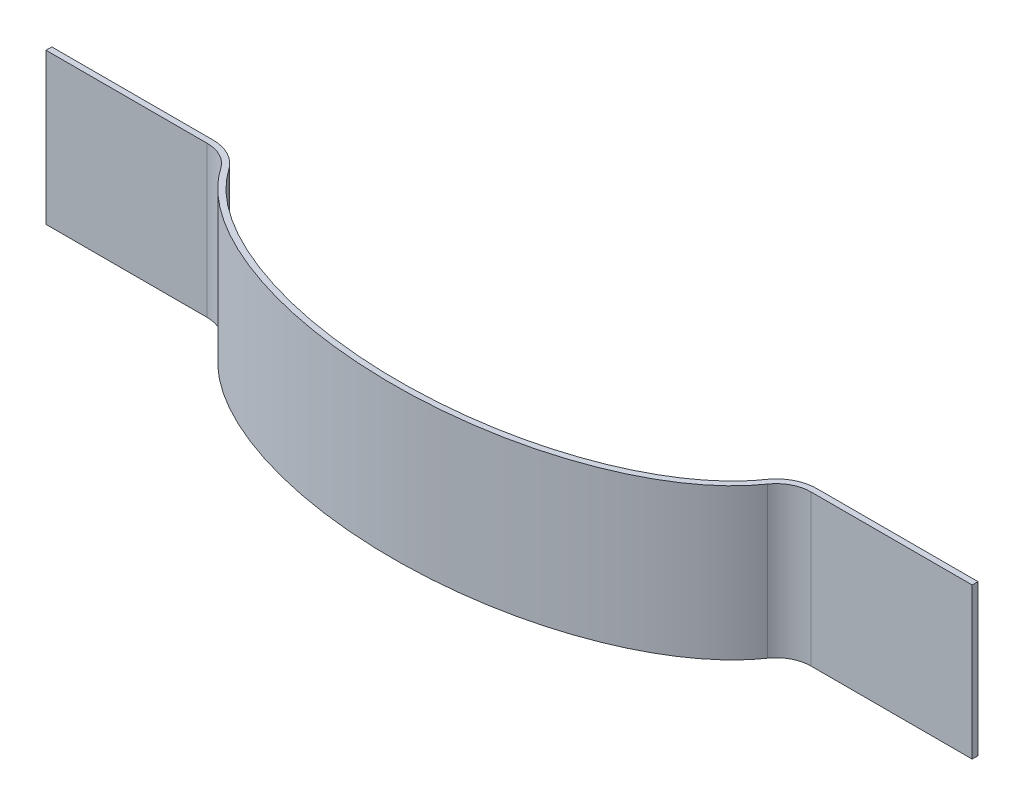
ISO-10303-21;
HEADER;
FILE_DESCRIPTION(('STEP AP214'),'2;1');
FILE_NAME('part.step','',(''),(''),'','','');
FILE_SCHEMA(('AUTOMOTIVE_DESIGN { 1 0 10303 214 1 1 1 1 }'));
ENDSEC;
DATA;
#1=APPLICATION_CONTEXT('core data for automotive mechanical design processes');
#2=APPLICATION_PROTOCOL_DEFINITION('international standard','automotive_design',2000,#1);
#3=PRODUCT_CONTEXT('',#1,'mechanical');
#4=PRODUCT('Part','Part','',(#3));
#5=PRODUCT_RELATED_PRODUCT_CATEGORY('part','',(#4));
#6=PRODUCT_DEFINITION_FORMATION('','',#4);
#7=PRODUCT_DEFINITION_CONTEXT('part definition',#1,'design');
#8=PRODUCT_DEFINITION('design','',#6,#7);
#9=PRODUCT_DEFINITION_SHAPE('','',#8);
#10=(LENGTH_UNIT() NAMED_UNIT(*) SI_UNIT(.MILLI.,.METRE.));
#11=(NAMED_UNIT(*) PLANE_ANGLE_UNIT() SI_UNIT($,.RADIAN.));
#12=(NAMED_UNIT(*) SI_UNIT($,.STERADIAN.) SOLID_ANGLE_UNIT());
#13=UNCERTAINTY_MEASURE_WITH_UNIT(LENGTH_MEASURE(1.E-05),#10,'distance_accuracy_value','');
#14=(GEOMETRIC_REPRESENTATION_CONTEXT(3) GLOBAL_UNCERTAINTY_ASSIGNED_CONTEXT((#13)) GLOBAL_UNIT_ASSIGNED_CONTEXT((#10,
#11,#12)) REPRESENTATION_CONTEXT('',''));
#15=CARTESIAN_POINT('',(0.,0.,0.));
#16=DIRECTION('',(0.,0.,1.));
#17=DIRECTION('',(1.,0.,0.));
#18=AXIS2_PLACEMENT_3D('',#15,#16,#17);
#19=CARTESIAN_POINT('',(82.8323720749977,15.9999999949704,4.99999999502958));
#20=DIRECTION('',(-1.,0.,0.));
#21=DIRECTION('',(0.,0.,1.));
#22=AXIS2_PLACEMENT_3D('',#19,#20,#21);
#23=PLANE('',#22);
#24=DIRECTION('',(0.,-1.,0.));
#25=VECTOR('',#24,1.);
#26=CARTESIAN_POINT('',(82.8323720749977,15.9999999949704,7.99999999502965));
#27=LINE('',#26,#25);
#28=CARTESIAN_POINT('',(82.8323720749977,15.9999999949704,7.99999999502965));
#29=VERTEX_POINT('',#28);
#30=CARTESIAN_POINT('',(82.8323720749977,3.,7.99999999502965));
#31=VERTEX_POINT('',#30);
#32=EDGE_CURVE('E405',#29,#31,#27,.T.);
#33=ORIENTED_EDGE('',*,*,#32,.T.);
#34=DIRECTION('',(0.,0.,-1.));
#35=VECTOR('',#34,1.);
#36=CARTESIAN_POINT('',(82.8323720749977,3.,4.99999999502958));
#37=LINE('',#36,#35);
#38=CARTESIAN_POINT('',(82.8323720749977,3.,7.49999999502962));
#39=VERTEX_POINT('',#38);
#40=EDGE_CURVE('E12',#31,#39,#37,.T.);
#41=ORIENTED_EDGE('',*,*,#40,.T.);
#42=DIRECTION('',(0.,-1.,0.));
#43=VECTOR('',#42,1.);
#44=CARTESIAN_POINT('',(82.8323720749977,15.9999999949704,7.49999999502962));
#45=LINE('',#44,#43);
#46=CARTESIAN_POINT('',(82.8323720749977,15.9999999949704,7.49999999502962));
#47=VERTEX_POINT('',#46);
#48=EDGE_CURVE('E322',#47,#39,#45,.T.);
#49=ORIENTED_EDGE('',*,*,#48,.F.);
#50=DIRECTION('',(0.,0.,-1.));
#51=VECTOR('',#50,1.);
#52=CARTESIAN_POINT('',(82.8323720749977,15.9999999949704,4.99999999502958));
#53=LINE('',#52,#51);
#54=EDGE_CURVE('E139',#29,#47,#53,.T.);
#55=ORIENTED_EDGE('',*,*,#54,.F.);
#56=EDGE_LOOP('',(#33,#41,#49,#55));
#57=FACE_BOUND('',#56,.T.);
#58=ADVANCED_FACE('F128',(#57),#23,.F.);
#59=CARTESIAN_POINT('',(3.,2.99999999999999,4.99999999502958));
#60=DIRECTION('',(1.,0.,0.));
#61=DIRECTION('',(0.,1.,0.));
#62=AXIS2_PLACEMENT_3D('',#59,#60,#61);
#63=PLANE('',#62);
#64=DIRECTION('',(0.,-1.,0.));
#65=VECTOR('',#64,1.);
#66=CARTESIAN_POINT('',(3.,15.9999999949704,7.99999999502963));
#67=LINE('',#66,#65);
#68=CARTESIAN_POINT('',(3.,15.9999999949704,7.99999999502963));
#69=VERTEX_POINT('',#68);
#70=CARTESIAN_POINT('',(3.,2.99999999999999,7.99999999502963));
#71=VERTEX_POINT('',#70);
#72=EDGE_CURVE('E400',#69,#71,#67,.T.);
#73=ORIENTED_EDGE('',*,*,#72,.F.);
#74=DIRECTION('',(0.,0.,-1.));
#75=VECTOR('',#74,1.);
#76=CARTESIAN_POINT('',(3.,15.9999999949704,4.99999999502958));
#77=LINE('',#76,#75);
#78=CARTESIAN_POINT('',(3.,15.9999999949704,7.49999999502963));
#79=VERTEX_POINT('',#78);
#80=EDGE_CURVE('E306',#69,#79,#77,.T.);
#81=ORIENTED_EDGE('',*,*,#80,.T.);
#82=DIRECTION('',(0.,-1.,0.));
#83=VECTOR('',#82,1.);
#84=CARTESIAN_POINT('',(3.,15.9999999949704,7.49999999502963));
#85=LINE('',#84,#83);
#86=CARTESIAN_POINT('',(3.,2.99999999999999,7.49999999502963));
#87=VERTEX_POINT('',#86);
#88=EDGE_CURVE('E327',#79,#87,#85,.T.);
#89=ORIENTED_EDGE('',*,*,#88,.T.);
#90=DIRECTION('',(0.,0.,-1.));
#91=VECTOR('',#90,1.);
#92=CARTESIAN_POINT('',(3.,2.99999999999999,4.99999999502958));
#93=LINE('',#92,#91);
#94=EDGE_CURVE('E304',#71,#87,#93,.T.);
#95=ORIENTED_EDGE('',*,*,#94,.F.);
#96=EDGE_LOOP('',(#73,#81,#89,#95));
#97=FACE_BOUND('',#96,.T.);
#98=ADVANCED_FACE('F263',(#97),#63,.F.);
#99=CARTESIAN_POINT('',(82.8323720749977,3.,4.99999999502958));
#100=DIRECTION('',(0.,1.,0.));
#101=DIRECTION('',(-1.,0.,0.));
#102=AXIS2_PLACEMENT_3D('',#99,#100,#101);
#103=PLANE('',#102);
#104=DIRECTION('',(-1.,0.,0.));
#105=VECTOR('',#104,1.);
#106=CARTESIAN_POINT('',(0.,2.99999999999999,7.99999999502965));
#107=LINE('',#106,#105);
#108=CARTESIAN_POINT('',(16.8897912138371,2.99999999999999,7.9999999950296));
#109=VERTEX_POINT('',#108);
#110=EDGE_CURVE('E412',#109,#71,#107,.T.);
#111=ORIENTED_EDGE('',*,*,#110,.T.);
#112=ORIENTED_EDGE('',*,*,#94,.T.);
#113=DIRECTION('',(-1.,0.,0.));
#114=VECTOR('',#113,1.);
#115=CARTESIAN_POINT('',(0.,2.99999999999999,7.49999999502965));
#116=LINE('',#115,#114);
#117=CARTESIAN_POINT('',(16.8897912138371,2.99999999999999,7.49999999502961));
#118=VERTEX_POINT('',#117);
#119=EDGE_CURVE('E289',#118,#87,#116,.T.);
#120=ORIENTED_EDGE('',*,*,#119,.F.);
#121=CARTESIAN_POINT('',(16.8897912138371,2.99999999999999,10.9999999950296));
#122=DIRECTION('',(0.,-1.,0.));
#123=DIRECTION('',(1.,0.,0.));
#124=AXIS2_PLACEMENT_3D('',#121,#122,#123);
#125=CIRCLE('',#124,3.5);
#126=CARTESIAN_POINT('',(19.7732084251539,2.99999999999999,9.01608840791637));
#127=VERTEX_POINT('',#126);
#128=EDGE_CURVE('E287',#118,#127,#125,.T.);
#129=ORIENTED_EDGE('',*,*,#128,.T.);
#130=CARTESIAN_POINT('',(66.0591636548461,3.,9.01608840791631));
#131=CARTESIAN_POINT('',(65.8609782411068,3.,9.30413109929429));
#132=CARTESIAN_POINT('',(65.6392122494322,3.,9.592108872473));
#133=CARTESIAN_POINT('',(65.1529097721361,3.,10.1606837205477));
#134=CARTESIAN_POINT('',(64.8880014474173,3.,10.4421405057993));
#135=CARTESIAN_POINT('',(64.0269985869341,3.,11.2771555746306));
#136=CARTESIAN_POINT('',(63.3619041269359,3.,11.8222183904558));
#137=CARTESIAN_POINT('',(61.8701014516906,3.,12.8596001608448));
#138=CARTESIAN_POINT('',(61.0407323037871,3.,13.3548807820699));
#139=CARTESIAN_POINT('',(59.2371366978285,3.,14.2748866720848));
#140=CARTESIAN_POINT('',(58.2664182998213,3.,14.6992581565983));
#141=CARTESIAN_POINT('',(56.2070771248374,3.,15.4702976127741));
#142=CARTESIAN_POINT('',(55.1184890831521,3.,15.8168086431886));
#143=CARTESIAN_POINT('',(52.845816595807,3.,16.4194606923131));
#144=CARTESIAN_POINT('',(51.6608311356633,3.,16.6746383178584));
#145=CARTESIAN_POINT('',(48.0193053532294,3.,17.2882983988129));
#146=CARTESIAN_POINT('',(45.4708927333613,3.,17.4999999950296));
#147=CARTESIAN_POINT('',(40.3614793466387,3.,17.4999999950296));
#148=CARTESIAN_POINT('',(37.8130667267706,3.,17.2882983988129));
#149=CARTESIAN_POINT('',(34.1715409443367,3.,16.6746383178585));
#150=CARTESIAN_POINT('',(32.9865554841931,3.,16.4194606923131));
#151=CARTESIAN_POINT('',(30.713882996848,3.,15.8168086431886));
#152=CARTESIAN_POINT('',(29.6252949551626,3.,15.4702976127742));
#153=CARTESIAN_POINT('',(27.5659537801788,3.,14.6992581565983));
#154=CARTESIAN_POINT('',(26.5952353821716,3.,14.2748866720848));
#155=CARTESIAN_POINT('',(24.791639776213,3.,13.3548807820699));
#156=CARTESIAN_POINT('',(23.9622706283095,3.,12.8596001608448));
#157=CARTESIAN_POINT('',(22.4704679530642,3.,11.8222183904558));
#158=CARTESIAN_POINT('',(21.8053734930658,3.,11.2771555746306));
#159=CARTESIAN_POINT('',(20.9443706325827,3.,10.4421405057993));
#160=CARTESIAN_POINT('',(20.6794623078639,2.99999999999999,10.1606837205478));
#161=CARTESIAN_POINT('',(20.1931598305679,2.99999999999999,9.59210887247306));
#162=CARTESIAN_POINT('',(19.9713938388932,2.99999999999999,9.30413109929432));
#163=CARTESIAN_POINT('',(19.7732084251539,2.99999999999999,9.01608840791635));
#164=B_SPLINE_CURVE_WITH_KNOTS('',3,(#130,#131,#132,#133,#134,#135,#136,#137,#138,#139,#140,
#141,#142,#143,#144,#145,#146,#147,#148,#149,#150,#151,#152,#153,#154,#155,#156,#157,#158,#159,
#160,#161,#162,#163),.UNSPECIFIED.,.F.,.F.,(4,2,2,2,2,2,2,2,2,2,2,2,2,2,2,2,4),(0.,
0.0312499999999999,0.0624999999999998,0.125,0.1875,0.249999999999999,0.312499999999999,
0.374999999999999,0.499999999999999,0.624999999999999,0.6875,0.75,0.8125,0.875,0.9375,0.96875,
1.),.UNSPECIFIED.);
#165=CARTESIAN_POINT('',(66.0591636548461,3.,9.01608840791635));
#166=VERTEX_POINT('',#165);
#167=EDGE_CURVE('E280',#166,#127,#164,.T.);
#168=ORIENTED_EDGE('',*,*,#167,.F.);
#169=CARTESIAN_POINT('',(68.9425808661629,3.,10.9999999950296));
#170=DIRECTION('',(0.,-1.,0.));
#171=DIRECTION('',(1.,0.,0.));
#172=AXIS2_PLACEMENT_3D('',#169,#170,#171);
#173=CIRCLE('',#172,3.49999999999999);
#174=CARTESIAN_POINT('',(68.9425808661629,3.,7.49999999502959));
#175=VERTEX_POINT('',#174);
#176=EDGE_CURVE('E284',#166,#175,#173,.T.);
#177=ORIENTED_EDGE('',*,*,#176,.T.);
#178=DIRECTION('',(-1.,0.,0.));
#179=VECTOR('',#178,1.);
#180=CARTESIAN_POINT('',(0.,2.99999999999999,7.49999999502933));
#181=LINE('',#180,#179);
#182=EDGE_CURVE('E369',#39,#175,#181,.T.);
#183=ORIENTED_EDGE('',*,*,#182,.F.);
#184=ORIENTED_EDGE('',*,*,#40,.F.);
#185=DIRECTION('',(-1.,0.,0.));
#186=VECTOR('',#185,1.);
#187=CARTESIAN_POINT('',(0.,2.99999999999999,7.99999999502933));
#188=LINE('',#187,#186);
#189=CARTESIAN_POINT('',(68.9425808661629,3.,7.99999999502959));
#190=VERTEX_POINT('',#189);
#191=EDGE_CURVE('E414',#31,#190,#188,.T.);
#192=ORIENTED_EDGE('',*,*,#191,.T.);
#193=CARTESIAN_POINT('',(68.9425808661629,3.,10.9999999950296));
#194=DIRECTION('',(0.,-1.,0.));
#195=DIRECTION('',(1.,0.,0.));
#196=AXIS2_PLACEMENT_3D('',#193,#194,#195);
#197=CIRCLE('',#196,2.99999999999999);
#198=CARTESIAN_POINT('',(66.4710803993199,3.,9.29950434893253));
#199=VERTEX_POINT('',#198);
#200=EDGE_CURVE('E417',#199,#190,#197,.T.);
#201=ORIENTED_EDGE('',*,*,#200,.F.);
#202=CARTESIAN_POINT('',(19.36129168068,2.99999999999999,9.29950434893252));
#203=CARTESIAN_POINT('',(19.5698626865659,2.99999999999999,9.60264146051514));
#204=CARTESIAN_POINT('',(19.8025047988218,2.99999999999999,9.90461276729878));
#205=CARTESIAN_POINT('',(20.3101694371193,2.99999999999999,10.4981638143711));
#206=CARTESIAN_POINT('',(20.5856921732367,2.99999999999999,10.7908052713509));
#207=CARTESIAN_POINT('',(21.4784451399431,2.99999999999999,11.6566121277013));
#208=CARTESIAN_POINT('',(22.1649108265516,2.99999999999999,12.2187459368349));
#209=CARTESIAN_POINT('',(23.6969093997215,2.99999999999999,13.2840794547596));
#210=CARTESIAN_POINT('',(24.5458606245487,2.99999999999999,13.7908025189969));
#211=CARTESIAN_POINT('',(26.386620984695,2.99999999999999,14.7297659805654));
#212=CARTESIAN_POINT('',(27.3743578150381,2.99999999999999,15.1614194233413));
#213=CARTESIAN_POINT('',(29.4662513365079,2.99999999999999,15.9446468277001));
#214=CARTESIAN_POINT('',(30.570366345285,2.99999999999999,16.2960324597855));
#215=CARTESIAN_POINT('',(32.8737573871757,2.99999999999999,16.9068302491986));
#216=CARTESIAN_POINT('',(34.0740448337519,2.99999999999999,17.1652583567247));
#217=CARTESIAN_POINT('',(37.7587974994172,2.99999999999999,17.7862029151889));
#218=CARTESIAN_POINT('',(40.3337153256127,2.99999999999999,17.9999999950296));
#219=CARTESIAN_POINT('',(45.4986567543873,2.99999999999999,17.9999999950296));
#220=CARTESIAN_POINT('',(48.0735745805828,3.,17.7862029151889));
#221=CARTESIAN_POINT('',(51.7583272462482,3.,17.1652583567247));
#222=CARTESIAN_POINT('',(52.9586146928244,3.,16.9068302491986));
#223=CARTESIAN_POINT('',(55.2620057347151,3.,16.2960324597855));
#224=CARTESIAN_POINT('',(56.3661207434921,3.,15.9446468277001));
#225=CARTESIAN_POINT('',(58.4580142649619,3.,15.1614194233413));
#226=CARTESIAN_POINT('',(59.4457510953051,3.,14.7297659805653));
#227=CARTESIAN_POINT('',(61.2865114554513,3.,13.7908025189969));
#228=CARTESIAN_POINT('',(62.1354626802785,3.,13.2840794547595));
#229=CARTESIAN_POINT('',(63.6674612534484,3.,12.2187459368349));
#230=CARTESIAN_POINT('',(64.3539269400569,3.,11.6566121277013));
#231=CARTESIAN_POINT('',(65.2466799067634,3.,10.7908052713508));
#232=CARTESIAN_POINT('',(65.5222026428807,3.,10.498163814371));
#233=CARTESIAN_POINT('',(66.0298672811782,3.,9.90461276729872));
#234=CARTESIAN_POINT('',(66.2625093934342,3.,9.6026414605151));
#235=CARTESIAN_POINT('',(66.47108039932,3.,9.29950434893248));
#236=B_SPLINE_CURVE_WITH_KNOTS('',3,(#202,#203,#204,#205,#206,#207,#208,#209,#210,#211,#212,
#213,#214,#215,#216,#217,#218,#219,#220,#221,#222,#223,#224,#225,#226,#227,#228,#229,#230,#231,
#232,#233,#234,#235),.UNSPECIFIED.,.F.,.F.,(4,2,2,2,2,2,2,2,2,2,2,2,2,2,2,2,4),(0.,
0.0312500000000002,0.0625000000000002,0.125,0.1875,0.250000000000001,0.312500000000001,
0.375000000000001,0.500000000000001,0.625000000000001,0.6875,0.75,0.8125,0.875,0.9375,0.96875,
1.),.UNSPECIFIED.);
#237=CARTESIAN_POINT('',(19.3612916806801,2.99999999999999,9.29950434893255));
#238=VERTEX_POINT('',#237);
#239=EDGE_CURVE('E228',#199,#238,#236,.F.);
#240=ORIENTED_EDGE('',*,*,#239,.T.);
#241=CARTESIAN_POINT('',(16.8897912138371,2.99999999999999,10.9999999950296));
#242=DIRECTION('',(0.,-1.,0.));
#243=DIRECTION('',(1.,0.,0.));
#244=AXIS2_PLACEMENT_3D('',#241,#242,#243);
#245=CIRCLE('',#244,3.);
#246=EDGE_CURVE('E245',#109,#238,#245,.T.);
#247=ORIENTED_EDGE('',*,*,#246,.F.);
#248=EDGE_LOOP('',(#111,#112,#120,#129,#168,#177,#183,#184,#192,#201,#240,#247));
#249=FACE_BOUND('',#248,.T.);
#250=ADVANCED_FACE('F130',(#249),#103,.F.);
#251=CARTESIAN_POINT('',(3.,15.9999999949704,4.99999999502958));
#252=DIRECTION('',(0.,-1.,0.));
#253=DIRECTION('',(1.,0.,0.));
#254=AXIS2_PLACEMENT_3D('',#251,#252,#253);
#255=PLANE('',#254);
#256=DIRECTION('',(-1.,0.,0.));
#257=VECTOR('',#256,1.);
#258=CARTESIAN_POINT('',(0.,15.9999999949704,7.99999999502965));
#259=LINE('',#258,#257);
#260=CARTESIAN_POINT('',(16.8897912138371,15.9999999949704,7.9999999950296));
#261=VERTEX_POINT('',#260);
#262=EDGE_CURVE('E407',#261,#69,#259,.T.);
#263=ORIENTED_EDGE('',*,*,#262,.F.);
#264=CARTESIAN_POINT('',(16.8897912138371,15.9999999949704,10.9999999950296));
#265=DIRECTION('',(0.,-1.,0.));
#266=DIRECTION('',(1.,0.,0.));
#267=AXIS2_PLACEMENT_3D('',#264,#265,#266);
#268=CIRCLE('',#267,3.);
#269=CARTESIAN_POINT('',(19.3612916806801,15.9999999949704,9.29950434893255));
#270=VERTEX_POINT('',#269);
#271=EDGE_CURVE('E231',#261,#270,#268,.T.);
#272=ORIENTED_EDGE('',*,*,#271,.T.);
#273=CARTESIAN_POINT('',(66.47108039932,15.9999999949704,9.29950434893248));
#274=CARTESIAN_POINT('',(66.2625093934342,15.9999999949704,9.6026414605151));
#275=CARTESIAN_POINT('',(66.0298672811782,15.9999999949704,9.90461276729872));
#276=CARTESIAN_POINT('',(65.5222026428807,15.9999999949704,10.498163814371));
#277=CARTESIAN_POINT('',(65.2466799067634,15.9999999949704,10.7908052713508));
#278=CARTESIAN_POINT('',(64.3539269400569,15.9999999949704,11.6566121277013));
#279=CARTESIAN_POINT('',(63.6674612534484,15.9999999949704,12.2187459368349));
#280=CARTESIAN_POINT('',(62.1354626802785,15.9999999949704,13.2840794547595));
#281=CARTESIAN_POINT('',(61.2865114554513,15.9999999949704,13.7908025189969));
#282=CARTESIAN_POINT('',(59.4457510953051,15.9999999949704,14.7297659805653));
#283=CARTESIAN_POINT('',(58.4580142649619,15.9999999949704,15.1614194233413));
#284=CARTESIAN_POINT('',(56.3661207434921,15.9999999949704,15.9446468277001));
#285=CARTESIAN_POINT('',(55.2620057347151,15.9999999949704,16.2960324597855));
#286=CARTESIAN_POINT('',(52.9586146928244,15.9999999949704,16.9068302491986));
#287=CARTESIAN_POINT('',(51.7583272462482,15.9999999949704,17.1652583567247));
#288=CARTESIAN_POINT('',(48.0735745805828,15.9999999949704,17.7862029151889));
#289=CARTESIAN_POINT('',(45.4986567543873,15.9999999949704,17.9999999950296));
#290=CARTESIAN_POINT('',(40.3337153256127,15.9999999949704,17.9999999950296));
#291=CARTESIAN_POINT('',(37.7587974994172,15.9999999949704,17.7862029151889));
#292=CARTESIAN_POINT('',(34.0740448337519,15.9999999949704,17.1652583567247));
#293=CARTESIAN_POINT('',(32.8737573871757,15.9999999949704,16.9068302491986));
#294=CARTESIAN_POINT('',(30.570366345285,15.9999999949704,16.2960324597855));
#295=CARTESIAN_POINT('',(29.4662513365079,15.9999999949704,15.9446468277001));
#296=CARTESIAN_POINT('',(27.3743578150381,15.9999999949704,15.1614194233413));
#297=CARTESIAN_POINT('',(26.386620984695,15.9999999949704,14.7297659805654));
#298=CARTESIAN_POINT('',(24.5458606245487,15.9999999949704,13.7908025189969));
#299=CARTESIAN_POINT('',(23.6969093997215,15.9999999949704,13.2840794547596));
#300=CARTESIAN_POINT('',(22.1649108265516,15.9999999949704,12.2187459368349));
#301=CARTESIAN_POINT('',(21.4784451399431,15.9999999949704,11.6566121277013));
#302=CARTESIAN_POINT('',(20.5856921732367,15.9999999949704,10.7908052713509));
#303=CARTESIAN_POINT('',(20.3101694371193,15.9999999949704,10.4981638143711));
#304=CARTESIAN_POINT('',(19.8025047988218,15.9999999949704,9.90461276729878));
#305=CARTESIAN_POINT('',(19.5698626865658,15.9999999949704,9.60264146051514));
#306=CARTESIAN_POINT('',(19.36129168068,15.9999999949704,9.29950434893252));
#307=B_SPLINE_CURVE_WITH_KNOTS('',3,(#273,#274,#275,#276,#277,#278,#279,#280,#281,#282,#283,
#284,#285,#286,#287,#288,#289,#290,#291,#292,#293,#294,#295,#296,#297,#298,#299,#300,#301,#302,
#303,#304,#305,#306),.UNSPECIFIED.,.F.,.F.,(4,2,2,2,2,2,2,2,2,2,2,2,2,2,2,2,4),(0.,
0.0312499999999999,0.0624999999999999,0.125,0.1875,0.25,0.3125,0.374999999999999,
0.499999999999999,0.624999999999999,0.687499999999999,0.749999999999999,0.8125,0.875,0.9375,
0.96875,1.),.UNSPECIFIED.);
#308=CARTESIAN_POINT('',(66.4710803993199,15.9999999949704,9.29950434893253));
#309=VERTEX_POINT('',#308);
#310=EDGE_CURVE('E224',#309,#270,#307,.T.);
#311=ORIENTED_EDGE('',*,*,#310,.F.);
#312=CARTESIAN_POINT('',(68.9425808661629,15.9999999949704,10.9999999950296));
#313=DIRECTION('',(0.,-1.,0.));
#314=DIRECTION('',(1.,0.,0.));
#315=AXIS2_PLACEMENT_3D('',#312,#313,#314);
#316=CIRCLE('',#315,2.99999999999999);
#317=CARTESIAN_POINT('',(68.9425808661629,15.9999999949703,7.9999999950296));
#318=VERTEX_POINT('',#317);
#319=EDGE_CURVE('E234',#309,#318,#316,.T.);
#320=ORIENTED_EDGE('',*,*,#319,.T.);
#321=DIRECTION('',(-1.,0.,0.));
#322=VECTOR('',#321,1.);
#323=CARTESIAN_POINT('',(0.,15.9999999949704,7.99999999502933));
#324=LINE('',#323,#322);
#325=EDGE_CURVE('E238',#29,#318,#324,.T.);
#326=ORIENTED_EDGE('',*,*,#325,.F.);
#327=ORIENTED_EDGE('',*,*,#54,.T.);
#328=DIRECTION('',(-1.,0.,0.));
#329=VECTOR('',#328,1.);
#330=CARTESIAN_POINT('',(0.,15.9999999949704,7.49999999502933));
#331=LINE('',#330,#329);
#332=CARTESIAN_POINT('',(68.9425808661629,15.9999999949704,7.49999999502959));
#333=VERTEX_POINT('',#332);
#334=EDGE_CURVE('E313',#47,#333,#331,.T.);
#335=ORIENTED_EDGE('',*,*,#334,.T.);
#336=CARTESIAN_POINT('',(68.9425808661629,15.9999999949704,10.9999999950296));
#337=DIRECTION('',(0.,-1.,0.));
#338=DIRECTION('',(1.,0.,0.));
#339=AXIS2_PLACEMENT_3D('',#336,#337,#338);
#340=CIRCLE('',#339,3.49999999999999);
#341=CARTESIAN_POINT('',(66.0591636548461,15.9999999949704,9.01608840791635));
#342=VERTEX_POINT('',#341);
#343=EDGE_CURVE('E370',#342,#333,#340,.T.);
#344=ORIENTED_EDGE('',*,*,#343,.F.);
#345=CARTESIAN_POINT('',(19.7732084251539,15.9999999949704,9.01608840791635));
#346=CARTESIAN_POINT('',(19.9713938388932,15.9999999949704,9.30413109929432));
#347=CARTESIAN_POINT('',(20.1931598305679,15.9999999949704,9.59210887247306));
#348=CARTESIAN_POINT('',(20.6794623078639,15.9999999949704,10.1606837205478));
#349=CARTESIAN_POINT('',(20.9443706325827,15.9999999949704,10.4421405057993));
#350=CARTESIAN_POINT('',(21.8053734930658,15.9999999949704,11.2771555746306));
#351=CARTESIAN_POINT('',(22.4704679530641,15.9999999949704,11.8222183904558));
#352=CARTESIAN_POINT('',(23.9622706283095,15.9999999949704,12.8596001608448));
#353=CARTESIAN_POINT('',(24.7916397762129,15.9999999949704,13.3548807820699));
#354=CARTESIAN_POINT('',(26.5952353821716,15.9999999949704,14.2748866720848));
#355=CARTESIAN_POINT('',(27.5659537801788,15.9999999949704,14.6992581565983));
#356=CARTESIAN_POINT('',(29.6252949551626,15.9999999949704,15.4702976127742));
#357=CARTESIAN_POINT('',(30.713882996848,15.9999999949704,15.8168086431886));
#358=CARTESIAN_POINT('',(32.9865554841931,15.9999999949704,16.4194606923131));
#359=CARTESIAN_POINT('',(34.1715409443367,15.9999999949704,16.6746383178585));
#360=CARTESIAN_POINT('',(37.8130667267706,15.9999999949704,17.2882983988129));
#361=CARTESIAN_POINT('',(40.3614793466387,15.9999999949704,17.4999999950296));
#362=CARTESIAN_POINT('',(45.4708927333613,15.9999999949704,17.4999999950296));
#363=CARTESIAN_POINT('',(48.0193053532294,15.9999999949704,17.2882983988129));
#364=CARTESIAN_POINT('',(51.6608311356633,15.9999999949704,16.6746383178584));
#365=CARTESIAN_POINT('',(52.845816595807,15.9999999949704,16.4194606923131));
#366=CARTESIAN_POINT('',(55.1184890831521,15.9999999949704,15.8168086431886));
#367=CARTESIAN_POINT('',(56.2070771248374,15.9999999949704,15.4702976127741));
#368=CARTESIAN_POINT('',(58.2664182998213,15.9999999949704,14.6992581565983));
#369=CARTESIAN_POINT('',(59.2371366978285,15.9999999949704,14.2748866720848));
#370=CARTESIAN_POINT('',(61.0407323037871,15.9999999949704,13.3548807820699));
#371=CARTESIAN_POINT('',(61.8701014516906,15.9999999949704,12.8596001608448));
#372=CARTESIAN_POINT('',(63.3619041269359,15.9999999949704,11.8222183904558));
#373=CARTESIAN_POINT('',(64.0269985869341,15.9999999949704,11.2771555746306));
#374=CARTESIAN_POINT('',(64.8880014474173,15.9999999949704,10.4421405057993));
#375=CARTESIAN_POINT('',(65.1529097721361,15.9999999949704,10.1606837205477));
#376=CARTESIAN_POINT('',(65.6392122494322,15.9999999949704,9.592108872473));
#377=CARTESIAN_POINT('',(65.8609782411068,15.9999999949704,9.30413109929429));
#378=CARTESIAN_POINT('',(66.0591636548461,15.9999999949704,9.01608840791631));
#379=B_SPLINE_CURVE_WITH_KNOTS('',3,(#345,#346,#347,#348,#349,#350,#351,#352,#353,#354,#355,
#356,#357,#358,#359,#360,#361,#362,#363,#364,#365,#366,#367,#368,#369,#370,#371,#372,#373,#374,
#375,#376,#377,#378),.UNSPECIFIED.,.F.,.F.,(4,2,2,2,2,2,2,2,2,2,2,2,2,2,2,2,4),(0.,0.03125,
0.0625,0.125,0.1875,0.25,0.3125,0.375000000000001,0.500000000000001,0.625000000000001,
0.687500000000001,0.750000000000001,0.8125,0.875,0.9375,0.96875,1.),.UNSPECIFIED.);
#380=CARTESIAN_POINT('',(19.7732084251539,15.9999999949704,9.01608840791635));
#381=VERTEX_POINT('',#380);
#382=EDGE_CURVE('E337',#342,#381,#379,.F.);
#383=ORIENTED_EDGE('',*,*,#382,.T.);
#384=CARTESIAN_POINT('',(16.8897912138371,15.9999999949704,10.9999999950296));
#385=DIRECTION('',(0.,-1.,0.));
#386=DIRECTION('',(1.,0.,0.));
#387=AXIS2_PLACEMENT_3D('',#384,#385,#386);
#388=CIRCLE('',#387,3.5);
#389=CARTESIAN_POINT('',(16.8897912138371,15.9999999949704,7.49999999502961));
#390=VERTEX_POINT('',#389);
#391=EDGE_CURVE('E366',#390,#381,#388,.T.);
#392=ORIENTED_EDGE('',*,*,#391,.F.);
#393=DIRECTION('',(-1.,0.,0.));
#394=VECTOR('',#393,1.);
#395=CARTESIAN_POINT('',(0.,15.9999999949704,7.49999999502965));
#396=LINE('',#395,#394);
#397=EDGE_CURVE('E324',#390,#79,#396,.T.);
#398=ORIENTED_EDGE('',*,*,#397,.T.);
#399=ORIENTED_EDGE('',*,*,#80,.F.);
#400=EDGE_LOOP('',(#263,#272,#311,#320,#326,#327,#335,#344,#383,#392,#398,#399));
#401=FACE_BOUND('',#400,.T.);
#402=ADVANCED_FACE('F243',(#401),#255,.F.);
#403=CARTESIAN_POINT('',(68.9425808661629,15.9999999949704,10.9999999950296));
#404=DIRECTION('',(0.,-1.,0.));
#405=DIRECTION('',(1.,0.,0.));
#406=AXIS2_PLACEMENT_3D('',#403,#404,#405);
#407=CYLINDRICAL_SURFACE('',#406,3.49999999999999);
#408=ORIENTED_EDGE('',*,*,#176,.F.);
#409=DIRECTION('',(0.,-1.,0.));
#410=VECTOR('',#409,1.);
#411=CARTESIAN_POINT('',(66.0591636548461,15.9999999949704,9.01608840791635));
#412=LINE('',#411,#410);
#413=EDGE_CURVE('E323',#342,#166,#412,.T.);
#414=ORIENTED_EDGE('',*,*,#413,.F.);
#415=ORIENTED_EDGE('',*,*,#343,.T.);
#416=DIRECTION('',(0.,-1.,0.));
#417=VECTOR('',#416,1.);
#418=CARTESIAN_POINT('',(68.9425808661629,15.9999999949704,7.49999999502959));
#419=LINE('',#418,#417);
#420=EDGE_CURVE('E307',#333,#175,#419,.T.);
#421=ORIENTED_EDGE('',*,*,#420,.T.);
#422=EDGE_LOOP('',(#408,#414,#415,#421));
#423=FACE_BOUND('',#422,.T.);
#424=ADVANCED_FACE('F262',(#423),#407,.T.);
#425=CARTESIAN_POINT('',(0.,15.9999999949704,7.49999999502933));
#426=DIRECTION('',(0.,0.,1.));
#427=DIRECTION('',(1.,0.,0.));
#428=AXIS2_PLACEMENT_3D('',#425,#426,#427);
#429=PLANE('',#428);
#430=ORIENTED_EDGE('',*,*,#182,.T.);
#431=ORIENTED_EDGE('',*,*,#420,.F.);
#432=ORIENTED_EDGE('',*,*,#334,.F.);
#433=ORIENTED_EDGE('',*,*,#48,.T.);
#434=EDGE_LOOP('',(#430,#431,#432,#433));
#435=FACE_BOUND('',#434,.T.);
#436=ADVANCED_FACE('F321',(#435),#429,.F.);
#437=CARTESIAN_POINT('',(0.,15.9999999949704,7.49999999502965));
#438=DIRECTION('',(0.,0.,1.));
#439=DIRECTION('',(1.,0.,0.));
#440=AXIS2_PLACEMENT_3D('',#437,#438,#439);
#441=PLANE('',#440);
#442=ORIENTED_EDGE('',*,*,#119,.T.);
#443=ORIENTED_EDGE('',*,*,#88,.F.);
#444=ORIENTED_EDGE('',*,*,#397,.F.);
#445=DIRECTION('',(0.,-1.,0.));
#446=VECTOR('',#445,1.);
#447=CARTESIAN_POINT('',(16.8897912138371,15.9999999949704,7.49999999502961));
#448=LINE('',#447,#446);
#449=EDGE_CURVE('E331',#390,#118,#448,.T.);
#450=ORIENTED_EDGE('',*,*,#449,.T.);
#451=EDGE_LOOP('',(#442,#443,#444,#450));
#452=FACE_BOUND('',#451,.T.);
#453=ADVANCED_FACE('F388',(#452),#441,.F.);
#454=CARTESIAN_POINT('',(16.8897912138371,15.9999999949704,10.9999999950296));
#455=DIRECTION('',(0.,-1.,0.));
#456=DIRECTION('',(1.,0.,0.));
#457=AXIS2_PLACEMENT_3D('',#454,#455,#456);
#458=CYLINDRICAL_SURFACE('',#457,3.5);
#459=ORIENTED_EDGE('',*,*,#128,.F.);
#460=ORIENTED_EDGE('',*,*,#449,.F.);
#461=ORIENTED_EDGE('',*,*,#391,.T.);
#462=DIRECTION('',(0.,-1.,0.));
#463=VECTOR('',#462,1.);
#464=CARTESIAN_POINT('',(19.7732084251539,15.9999999949704,9.01608840791637));
#465=LINE('',#464,#463);
#466=EDGE_CURVE('E155',#381,#127,#465,.T.);
#467=ORIENTED_EDGE('',*,*,#466,.T.);
#468=EDGE_LOOP('',(#459,#460,#461,#467));
#469=FACE_BOUND('',#468,.T.);
#470=ADVANCED_FACE('F352',(#469),#458,.T.);
#471=CARTESIAN_POINT('',(66.0591636548461,15.9999999949704,9.01608840791631));
#472=CARTESIAN_POINT('',(65.8609782411068,15.9999999949704,9.30413109929429));
#473=CARTESIAN_POINT('',(65.6392122494322,15.9999999949704,9.592108872473));
#474=CARTESIAN_POINT('',(65.1529097721361,15.9999999949704,10.1606837205477));
#475=CARTESIAN_POINT('',(64.8880014474173,15.9999999949704,10.4421405057993));
#476=CARTESIAN_POINT('',(64.0269985869341,15.9999999949704,11.2771555746306));
#477=CARTESIAN_POINT('',(63.3619041269359,15.9999999949704,11.8222183904558));
#478=CARTESIAN_POINT('',(61.8701014516906,15.9999999949704,12.8596001608448));
#479=CARTESIAN_POINT('',(61.0407323037871,15.9999999949704,13.3548807820699));
#480=CARTESIAN_POINT('',(59.2371366978285,15.9999999949704,14.2748866720848));
#481=CARTESIAN_POINT('',(58.2664182998213,15.9999999949704,14.6992581565983));
#482=CARTESIAN_POINT('',(56.2070771248374,15.9999999949704,15.4702976127741));
#483=CARTESIAN_POINT('',(55.1184890831521,15.9999999949704,15.8168086431886));
#484=CARTESIAN_POINT('',(52.845816595807,15.9999999949704,16.4194606923131));
#485=CARTESIAN_POINT('',(51.6608311356633,15.9999999949704,16.6746383178584));
#486=CARTESIAN_POINT('',(48.0193053532294,15.9999999949704,17.2882983988129));
#487=CARTESIAN_POINT('',(45.4708927333613,15.9999999949704,17.4999999950296));
#488=CARTESIAN_POINT('',(40.3614793466387,15.9999999949704,17.4999999950296));
#489=CARTESIAN_POINT('',(37.8130667267706,15.9999999949704,17.2882983988129));
#490=CARTESIAN_POINT('',(34.1715409443367,15.9999999949704,16.6746383178585));
#491=CARTESIAN_POINT('',(32.9865554841931,15.9999999949704,16.4194606923131));
#492=CARTESIAN_POINT('',(30.713882996848,15.9999999949704,15.8168086431886));
#493=CARTESIAN_POINT('',(29.6252949551626,15.9999999949704,15.4702976127742));
#494=CARTESIAN_POINT('',(27.5659537801788,15.9999999949704,14.6992581565983));
#495=CARTESIAN_POINT('',(26.5952353821716,15.9999999949704,14.2748866720848));
#496=CARTESIAN_POINT('',(24.7916397762129,15.9999999949704,13.3548807820699));
#497=CARTESIAN_POINT('',(23.9622706283095,15.9999999949704,12.8596001608448));
#498=CARTESIAN_POINT('',(22.4704679530641,15.9999999949704,11.8222183904558));
#499=CARTESIAN_POINT('',(21.8053734930658,15.9999999949704,11.2771555746306));
#500=CARTESIAN_POINT('',(20.9443706325827,15.9999999949704,10.4421405057993));
#501=CARTESIAN_POINT('',(20.6794623078639,15.9999999949704,10.1606837205478));
#502=CARTESIAN_POINT('',(20.1931598305679,15.9999999949704,9.59210887247306));
#503=CARTESIAN_POINT('',(19.9713938388932,15.9999999949704,9.30413109929432));
#504=CARTESIAN_POINT('',(19.7732084251539,15.9999999949704,9.01608840791635));
#505=B_SPLINE_CURVE_WITH_KNOTS('',3,(#471,#472,#473,#474,#475,#476,#477,#478,#479,#480,#481,
#482,#483,#484,#485,#486,#487,#488,#489,#490,#491,#492,#493,#494,#495,#496,#497,#498,#499,#500,
#501,#502,#503,#504),.UNSPECIFIED.,.F.,.F.,(4,2,2,2,2,2,2,2,2,2,2,2,2,2,2,2,4),(0.,
0.0312499999999999,0.0624999999999998,0.125,0.1875,0.249999999999999,0.312499999999999,
0.374999999999999,0.499999999999999,0.624999999999999,0.6875,0.75,0.8125,0.875,0.9375,0.96875,
1.),.UNSPECIFIED.);
#506=DIRECTION('',(0.,-1.,0.));
#507=VECTOR('',#506,1.);
#508=SURFACE_OF_LINEAR_EXTRUSION('',#505,#507);
#509=ORIENTED_EDGE('',*,*,#167,.T.);
#510=ORIENTED_EDGE('',*,*,#466,.F.);
#511=ORIENTED_EDGE('',*,*,#382,.F.);
#512=ORIENTED_EDGE('',*,*,#413,.T.);
#513=EDGE_LOOP('',(#509,#510,#511,#512));
#514=FACE_BOUND('',#513,.T.);
#515=ADVANCED_FACE('F342',(#514),#508,.F.);
#516=CARTESIAN_POINT('',(66.47108039932,15.9999999949704,9.29950434893248));
#517=CARTESIAN_POINT('',(66.2625093934342,15.9999999949704,9.6026414605151));
#518=CARTESIAN_POINT('',(66.0298672811782,15.9999999949704,9.90461276729872));
#519=CARTESIAN_POINT('',(65.5222026428807,15.9999999949704,10.498163814371));
#520=CARTESIAN_POINT('',(65.2466799067634,15.9999999949704,10.7908052713508));
#521=CARTESIAN_POINT('',(64.3539269400569,15.9999999949704,11.6566121277013));
#522=CARTESIAN_POINT('',(63.6674612534484,15.9999999949704,12.2187459368349));
#523=CARTESIAN_POINT('',(62.1354626802785,15.9999999949704,13.2840794547595));
#524=CARTESIAN_POINT('',(61.2865114554513,15.9999999949704,13.7908025189969));
#525=CARTESIAN_POINT('',(59.4457510953051,15.9999999949704,14.7297659805653));
#526=CARTESIAN_POINT('',(58.4580142649619,15.9999999949704,15.1614194233413));
#527=CARTESIAN_POINT('',(56.3661207434921,15.9999999949704,15.9446468277001));
#528=CARTESIAN_POINT('',(55.2620057347151,15.9999999949704,16.2960324597855));
#529=CARTESIAN_POINT('',(52.9586146928244,15.9999999949704,16.9068302491986));
#530=CARTESIAN_POINT('',(51.7583272462482,15.9999999949704,17.1652583567247));
#531=CARTESIAN_POINT('',(48.0735745805828,15.9999999949704,17.7862029151889));
#532=CARTESIAN_POINT('',(45.4986567543873,15.9999999949704,17.9999999950296));
#533=CARTESIAN_POINT('',(40.3337153256127,15.9999999949704,17.9999999950296));
#534=CARTESIAN_POINT('',(37.7587974994172,15.9999999949704,17.7862029151889));
#535=CARTESIAN_POINT('',(34.0740448337519,15.9999999949704,17.1652583567247));
#536=CARTESIAN_POINT('',(32.8737573871757,15.9999999949704,16.9068302491986));
#537=CARTESIAN_POINT('',(30.570366345285,15.9999999949704,16.2960324597855));
#538=CARTESIAN_POINT('',(29.4662513365079,15.9999999949704,15.9446468277001));
#539=CARTESIAN_POINT('',(27.3743578150381,15.9999999949704,15.1614194233413));
#540=CARTESIAN_POINT('',(26.386620984695,15.9999999949704,14.7297659805654));
#541=CARTESIAN_POINT('',(24.5458606245487,15.9999999949704,13.7908025189969));
#542=CARTESIAN_POINT('',(23.6969093997215,15.9999999949704,13.2840794547596));
#543=CARTESIAN_POINT('',(22.1649108265516,15.9999999949704,12.2187459368349));
#544=CARTESIAN_POINT('',(21.4784451399431,15.9999999949704,11.6566121277013));
#545=CARTESIAN_POINT('',(20.5856921732367,15.9999999949704,10.7908052713509));
#546=CARTESIAN_POINT('',(20.3101694371193,15.9999999949704,10.4981638143711));
#547=CARTESIAN_POINT('',(19.8025047988218,15.9999999949704,9.90461276729878));
#548=CARTESIAN_POINT('',(19.5698626865658,15.9999999949704,9.60264146051514));
#549=CARTESIAN_POINT('',(19.36129168068,15.9999999949704,9.29950434893252));
#550=B_SPLINE_CURVE_WITH_KNOTS('',3,(#516,#517,#518,#519,#520,#521,#522,#523,#524,#525,#526,
#527,#528,#529,#530,#531,#532,#533,#534,#535,#536,#537,#538,#539,#540,#541,#542,#543,#544,#545,
#546,#547,#548,#549),.UNSPECIFIED.,.F.,.F.,(4,2,2,2,2,2,2,2,2,2,2,2,2,2,2,2,4),(0.,
0.0312499999999999,0.0624999999999999,0.125,0.1875,0.25,0.3125,0.374999999999999,
0.499999999999999,0.624999999999999,0.687499999999999,0.749999999999999,0.8125,0.875,0.9375,
0.96875,1.),.UNSPECIFIED.);
#551=DIRECTION('',(0.,-1.,0.));
#552=VECTOR('',#551,1.);
#553=SURFACE_OF_LINEAR_EXTRUSION('',#550,#552);
#554=ORIENTED_EDGE('',*,*,#239,.F.);
#555=DIRECTION('',(0.,-1.,0.));
#556=VECTOR('',#555,1.);
#557=CARTESIAN_POINT('',(66.4710803993199,15.9999999949704,9.29950434893253));
#558=LINE('',#557,#556);
#559=EDGE_CURVE('E221',#309,#199,#558,.T.);
#560=ORIENTED_EDGE('',*,*,#559,.F.);
#561=ORIENTED_EDGE('',*,*,#310,.T.);
#562=DIRECTION('',(0.,-1.,0.));
#563=VECTOR('',#562,1.);
#564=CARTESIAN_POINT('',(19.3612916806801,15.9999999949704,9.29950434893255));
#565=LINE('',#564,#563);
#566=EDGE_CURVE('E291',#270,#238,#565,.T.);
#567=ORIENTED_EDGE('',*,*,#566,.T.);
#568=EDGE_LOOP('',(#554,#560,#561,#567));
#569=FACE_BOUND('',#568,.T.);
#570=ADVANCED_FACE('F222',(#569),#553,.T.);
#571=CARTESIAN_POINT('',(16.8897912138371,15.9999999949704,10.9999999950296));
#572=DIRECTION('',(0.,-1.,0.));
#573=DIRECTION('',(1.,0.,0.));
#574=AXIS2_PLACEMENT_3D('',#571,#572,#573);
#575=CYLINDRICAL_SURFACE('',#574,3.);
#576=ORIENTED_EDGE('',*,*,#246,.T.);
#577=ORIENTED_EDGE('',*,*,#566,.F.);
#578=ORIENTED_EDGE('',*,*,#271,.F.);
#579=DIRECTION('',(0.,-1.,0.));
#580=VECTOR('',#579,1.);
#581=CARTESIAN_POINT('',(16.8897912138371,15.9999999949704,7.9999999950296));
#582=LINE('',#581,#580);
#583=EDGE_CURVE('E293',#261,#109,#582,.T.);
#584=ORIENTED_EDGE('',*,*,#583,.T.);
#585=EDGE_LOOP('',(#576,#577,#578,#584));
#586=FACE_BOUND('',#585,.T.);
#587=ADVANCED_FACE('F437',(#586),#575,.F.);
#588=CARTESIAN_POINT('',(0.,15.9999999949704,7.99999999502965));
#589=DIRECTION('',(0.,0.,1.));
#590=DIRECTION('',(1.,0.,0.));
#591=AXIS2_PLACEMENT_3D('',#588,#589,#590);
#592=PLANE('',#591);
#593=ORIENTED_EDGE('',*,*,#110,.F.);
#594=ORIENTED_EDGE('',*,*,#583,.F.);
#595=ORIENTED_EDGE('',*,*,#262,.T.);
#596=ORIENTED_EDGE('',*,*,#72,.T.);
#597=EDGE_LOOP('',(#593,#594,#595,#596));
#598=FACE_BOUND('',#597,.T.);
#599=ADVANCED_FACE('F466',(#598),#592,.T.);
#600=CARTESIAN_POINT('',(0.,15.9999999949704,7.99999999502933));
#601=DIRECTION('',(0.,0.,1.));
#602=DIRECTION('',(1.,0.,0.));
#603=AXIS2_PLACEMENT_3D('',#600,#601,#602);
#604=PLANE('',#603);
#605=ORIENTED_EDGE('',*,*,#191,.F.);
#606=ORIENTED_EDGE('',*,*,#32,.F.);
#607=ORIENTED_EDGE('',*,*,#325,.T.);
#608=DIRECTION('',(0.,-1.,0.));
#609=VECTOR('',#608,1.);
#610=CARTESIAN_POINT('',(68.9425808661629,15.9999999949704,7.99999999502959));
#611=LINE('',#610,#609);
#612=EDGE_CURVE('E147',#318,#190,#611,.T.);
#613=ORIENTED_EDGE('',*,*,#612,.T.);
#614=EDGE_LOOP('',(#605,#606,#607,#613));
#615=FACE_BOUND('',#614,.T.);
#616=ADVANCED_FACE('F464',(#615),#604,.T.);
#617=CARTESIAN_POINT('',(68.9425808661629,15.9999999949704,10.9999999950296));
#618=DIRECTION('',(0.,-1.,0.));
#619=DIRECTION('',(1.,0.,0.));
#620=AXIS2_PLACEMENT_3D('',#617,#618,#619);
#621=CYLINDRICAL_SURFACE('',#620,2.99999999999999);
#622=ORIENTED_EDGE('',*,*,#200,.T.);
#623=ORIENTED_EDGE('',*,*,#612,.F.);
#624=ORIENTED_EDGE('',*,*,#319,.F.);
#625=ORIENTED_EDGE('',*,*,#559,.T.);
#626=EDGE_LOOP('',(#622,#623,#624,#625));
#627=FACE_BOUND('',#626,.T.);
#628=ADVANCED_FACE('F235',(#627),#621,.F.);
#629=CLOSED_SHELL('',(#58,#98,#250,#402,#424,#436,#453,#470,#515,#570,#587,#599,#616,#628));
#630=MANIFOLD_SOLID_BREP('B2',#629);
#631=ADVANCED_BREP_SHAPE_REPRESENTATION('',(#18,#630),#14);
#632=SHAPE_DEFINITION_REPRESENTATION(#9,#631);
ENDSEC;
END-ISO-10303-21;
